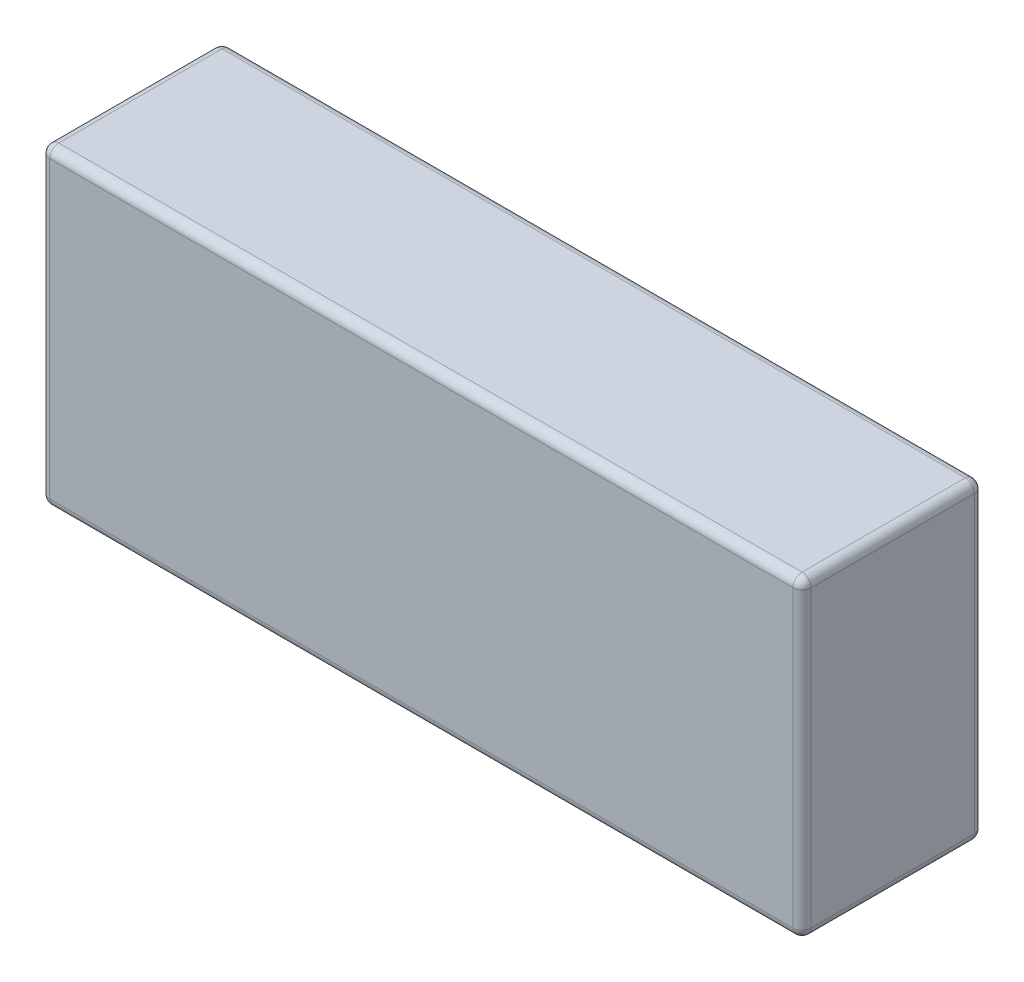
ISO-10303-21;
HEADER;
FILE_DESCRIPTION(('STEP AP214'),'2;1');
FILE_NAME('part.step','',(''),(''),'','','');
FILE_SCHEMA(('AUTOMOTIVE_DESIGN { 1 0 10303 214 1 1 1 1 }'));
ENDSEC;
DATA;
#1=APPLICATION_CONTEXT('core data for automotive mechanical design processes');
#2=APPLICATION_PROTOCOL_DEFINITION('international standard','automotive_design',2000,#1);
#3=PRODUCT_CONTEXT('',#1,'mechanical');
#4=PRODUCT('Part','Part','',(#3));
#5=PRODUCT_RELATED_PRODUCT_CATEGORY('part','',(#4));
#6=PRODUCT_DEFINITION_FORMATION('','',#4);
#7=PRODUCT_DEFINITION_CONTEXT('part definition',#1,'design');
#8=PRODUCT_DEFINITION('design','',#6,#7);
#9=PRODUCT_DEFINITION_SHAPE('','',#8);
#10=(LENGTH_UNIT() NAMED_UNIT(*) SI_UNIT(.MILLI.,.METRE.));
#11=(NAMED_UNIT(*) PLANE_ANGLE_UNIT() SI_UNIT($,.RADIAN.));
#12=(NAMED_UNIT(*) SI_UNIT($,.STERADIAN.) SOLID_ANGLE_UNIT());
#13=UNCERTAINTY_MEASURE_WITH_UNIT(LENGTH_MEASURE(1.E-05),#10,'distance_accuracy_value','');
#14=(GEOMETRIC_REPRESENTATION_CONTEXT(3) GLOBAL_UNCERTAINTY_ASSIGNED_CONTEXT((#13)) GLOBAL_UNIT_ASSIGNED_CONTEXT((#10,
#11,#12)) REPRESENTATION_CONTEXT('',''));
#15=CARTESIAN_POINT('',(0.,0.,0.));
#16=DIRECTION('',(0.,0.,1.));
#17=DIRECTION('',(1.,0.,0.));
#18=AXIS2_PLACEMENT_3D('',#15,#16,#17);
#19=CARTESIAN_POINT('',(168.,69.,0.));
#20=DIRECTION('',(0.,0.,1.));
#21=DIRECTION('',(1.,0.,0.));
#22=AXIS2_PLACEMENT_3D('',#19,#20,#21);
#23=PLANE('',#22);
#24=DIRECTION('',(0.,-1.,0.));
#25=VECTOR('',#24,1.);
#26=CARTESIAN_POINT('',(2.,69.,0.));
#27=LINE('',#26,#25);
#28=CARTESIAN_POINT('',(2.,2.,0.));
#29=VERTEX_POINT('',#28);
#30=CARTESIAN_POINT('',(2.,67.,0.));
#31=VERTEX_POINT('',#30);
#32=EDGE_CURVE('E132',#29,#31,#27,.F.);
#33=ORIENTED_EDGE('',*,*,#32,.T.);
#34=DIRECTION('',(-1.,0.,0.));
#35=VECTOR('',#34,1.);
#36=CARTESIAN_POINT('',(168.,67.,0.));
#37=LINE('',#36,#35);
#38=CARTESIAN_POINT('',(166.,67.,0.));
#39=VERTEX_POINT('',#38);
#40=EDGE_CURVE('E169',#31,#39,#37,.F.);
#41=ORIENTED_EDGE('',*,*,#40,.T.);
#42=DIRECTION('',(0.,-1.,0.));
#43=VECTOR('',#42,1.);
#44=CARTESIAN_POINT('',(166.,69.,0.));
#45=LINE('',#44,#43);
#46=CARTESIAN_POINT('',(166.,2.,0.));
#47=VERTEX_POINT('',#46);
#48=EDGE_CURVE('E166',#39,#47,#45,.T.);
#49=ORIENTED_EDGE('',*,*,#48,.T.);
#50=DIRECTION('',(-1.,0.,0.));
#51=VECTOR('',#50,1.);
#52=CARTESIAN_POINT('',(168.,2.,0.));
#53=LINE('',#52,#51);
#54=EDGE_CURVE('E161',#47,#29,#53,.T.);
#55=ORIENTED_EDGE('',*,*,#54,.T.);
#56=EDGE_LOOP('',(#33,#41,#49,#55));
#57=FACE_BOUND('',#56,.T.);
#58=ADVANCED_FACE('F37',(#57),#23,.F.);
#59=CARTESIAN_POINT('',(0.,69.,0.));
#60=DIRECTION('',(1.,0.,0.));
#61=DIRECTION('',(0.,0.,-1.));
#62=AXIS2_PLACEMENT_3D('',#59,#60,#61);
#63=PLANE('',#62);
#64=DIRECTION('',(0.,-1.,0.));
#65=VECTOR('',#64,1.);
#66=CARTESIAN_POINT('',(0.,69.,38.));
#67=LINE('',#66,#65);
#68=CARTESIAN_POINT('',(0.,2.,38.));
#69=VERTEX_POINT('',#68);
#70=CARTESIAN_POINT('',(0.,67.,38.));
#71=VERTEX_POINT('',#70);
#72=EDGE_CURVE('E154',#69,#71,#67,.F.);
#73=ORIENTED_EDGE('',*,*,#72,.T.);
#74=DIRECTION('',(0.,0.,1.));
#75=VECTOR('',#74,1.);
#76=CARTESIAN_POINT('',(0.,67.,0.));
#77=LINE('',#76,#75);
#78=CARTESIAN_POINT('',(0.,67.,2.));
#79=VERTEX_POINT('',#78);
#80=EDGE_CURVE('E158',#71,#79,#77,.F.);
#81=ORIENTED_EDGE('',*,*,#80,.T.);
#82=DIRECTION('',(0.,-1.,0.));
#83=VECTOR('',#82,1.);
#84=CARTESIAN_POINT('',(0.,69.,2.));
#85=LINE('',#84,#83);
#86=CARTESIAN_POINT('',(0.,2.,2.));
#87=VERTEX_POINT('',#86);
#88=EDGE_CURVE('E130',#79,#87,#85,.T.);
#89=ORIENTED_EDGE('',*,*,#88,.T.);
#90=DIRECTION('',(0.,0.,1.));
#91=VECTOR('',#90,1.);
#92=CARTESIAN_POINT('',(0.,2.,0.));
#93=LINE('',#92,#91);
#94=EDGE_CURVE('E148',#87,#69,#93,.T.);
#95=ORIENTED_EDGE('',*,*,#94,.T.);
#96=EDGE_LOOP('',(#73,#81,#89,#95));
#97=FACE_BOUND('',#96,.T.);
#98=ADVANCED_FACE('F156',(#97),#63,.F.);
#99=CARTESIAN_POINT('',(0.,69.,40.));
#100=DIRECTION('',(0.,0.,-1.));
#101=DIRECTION('',(-1.,0.,0.));
#102=AXIS2_PLACEMENT_3D('',#99,#100,#101);
#103=PLANE('',#102);
#104=DIRECTION('',(0.,-1.,0.));
#105=VECTOR('',#104,1.);
#106=CARTESIAN_POINT('',(166.,69.,40.));
#107=LINE('',#106,#105);
#108=CARTESIAN_POINT('',(166.,2.,40.));
#109=VERTEX_POINT('',#108);
#110=CARTESIAN_POINT('',(166.,67.,40.));
#111=VERTEX_POINT('',#110);
#112=EDGE_CURVE('E173',#109,#111,#107,.F.);
#113=ORIENTED_EDGE('',*,*,#112,.T.);
#114=DIRECTION('',(1.,0.,0.));
#115=VECTOR('',#114,1.);
#116=CARTESIAN_POINT('',(0.,67.,40.));
#117=LINE('',#116,#115);
#118=CARTESIAN_POINT('',(2.,67.,40.));
#119=VERTEX_POINT('',#118);
#120=EDGE_CURVE('E178',#111,#119,#117,.F.);
#121=ORIENTED_EDGE('',*,*,#120,.T.);
#122=DIRECTION('',(0.,-1.,0.));
#123=VECTOR('',#122,1.);
#124=CARTESIAN_POINT('',(2.,69.,40.));
#125=LINE('',#124,#123);
#126=CARTESIAN_POINT('',(2.,2.,40.));
#127=VERTEX_POINT('',#126);
#128=EDGE_CURVE('E175',#119,#127,#125,.T.);
#129=ORIENTED_EDGE('',*,*,#128,.T.);
#130=DIRECTION('',(1.,0.,0.));
#131=VECTOR('',#130,1.);
#132=CARTESIAN_POINT('',(0.,2.,40.));
#133=LINE('',#132,#131);
#134=EDGE_CURVE('E171',#127,#109,#133,.T.);
#135=ORIENTED_EDGE('',*,*,#134,.T.);
#136=EDGE_LOOP('',(#113,#121,#129,#135));
#137=FACE_BOUND('',#136,.T.);
#138=ADVANCED_FACE('F283',(#137),#103,.F.);
#139=CARTESIAN_POINT('',(168.,69.,40.));
#140=DIRECTION('',(-1.,0.,0.));
#141=DIRECTION('',(0.,0.,1.));
#142=AXIS2_PLACEMENT_3D('',#139,#140,#141);
#143=PLANE('',#142);
#144=DIRECTION('',(0.,-1.,0.));
#145=VECTOR('',#144,1.);
#146=CARTESIAN_POINT('',(168.,69.,2.));
#147=LINE('',#146,#145);
#148=CARTESIAN_POINT('',(168.,2.,2.));
#149=VERTEX_POINT('',#148);
#150=CARTESIAN_POINT('',(168.,67.,2.));
#151=VERTEX_POINT('',#150);
#152=EDGE_CURVE('E182',#149,#151,#147,.F.);
#153=ORIENTED_EDGE('',*,*,#152,.T.);
#154=DIRECTION('',(0.,0.,-1.));
#155=VECTOR('',#154,1.);
#156=CARTESIAN_POINT('',(168.,67.,40.));
#157=LINE('',#156,#155);
#158=CARTESIAN_POINT('',(168.,67.,38.));
#159=VERTEX_POINT('',#158);
#160=EDGE_CURVE('E187',#151,#159,#157,.F.);
#161=ORIENTED_EDGE('',*,*,#160,.T.);
#162=DIRECTION('',(0.,-1.,0.));
#163=VECTOR('',#162,1.);
#164=CARTESIAN_POINT('',(168.,69.,38.));
#165=LINE('',#164,#163);
#166=CARTESIAN_POINT('',(168.,2.,38.));
#167=VERTEX_POINT('',#166);
#168=EDGE_CURVE('E184',#159,#167,#165,.T.);
#169=ORIENTED_EDGE('',*,*,#168,.T.);
#170=DIRECTION('',(0.,0.,-1.));
#171=VECTOR('',#170,1.);
#172=CARTESIAN_POINT('',(168.,2.,40.));
#173=LINE('',#172,#171);
#174=EDGE_CURVE('E180',#167,#149,#173,.T.);
#175=ORIENTED_EDGE('',*,*,#174,.T.);
#176=EDGE_LOOP('',(#153,#161,#169,#175));
#177=FACE_BOUND('',#176,.T.);
#178=ADVANCED_FACE('F293',(#177),#143,.F.);
#179=CARTESIAN_POINT('',(0.,69.,0.));
#180=DIRECTION('',(0.,1.,0.));
#181=DIRECTION('',(0.,0.,1.));
#182=AXIS2_PLACEMENT_3D('',#179,#180,#181);
#183=PLANE('',#182);
#184=DIRECTION('',(1.,0.,0.));
#185=VECTOR('',#184,1.);
#186=CARTESIAN_POINT('',(168.,69.,38.));
#187=LINE('',#186,#185);
#188=CARTESIAN_POINT('',(2.,69.,38.));
#189=VERTEX_POINT('',#188);
#190=CARTESIAN_POINT('',(166.,69.,38.));
#191=VERTEX_POINT('',#190);
#192=EDGE_CURVE('E193',#189,#191,#187,.T.);
#193=ORIENTED_EDGE('',*,*,#192,.T.);
#194=DIRECTION('',(0.,0.,-1.));
#195=VECTOR('',#194,1.);
#196=CARTESIAN_POINT('',(166.,69.,0.));
#197=LINE('',#196,#195);
#198=CARTESIAN_POINT('',(166.,69.,2.));
#199=VERTEX_POINT('',#198);
#200=EDGE_CURVE('E195',#191,#199,#197,.T.);
#201=ORIENTED_EDGE('',*,*,#200,.T.);
#202=DIRECTION('',(-1.,0.,0.));
#203=VECTOR('',#202,1.);
#204=CARTESIAN_POINT('',(0.,69.,2.));
#205=LINE('',#204,#203);
#206=CARTESIAN_POINT('',(2.,69.,2.));
#207=VERTEX_POINT('',#206);
#208=EDGE_CURVE('E189',#199,#207,#205,.T.);
#209=ORIENTED_EDGE('',*,*,#208,.T.);
#210=DIRECTION('',(0.,0.,1.));
#211=VECTOR('',#210,1.);
#212=CARTESIAN_POINT('',(2.,69.,40.));
#213=LINE('',#212,#211);
#214=EDGE_CURVE('E191',#207,#189,#213,.T.);
#215=ORIENTED_EDGE('',*,*,#214,.T.);
#216=EDGE_LOOP('',(#193,#201,#209,#215));
#217=FACE_BOUND('',#216,.T.);
#218=ADVANCED_FACE('F275',(#217),#183,.T.);
#219=CARTESIAN_POINT('',(0.,0.,0.));
#220=DIRECTION('',(0.,1.,0.));
#221=DIRECTION('',(0.,0.,1.));
#222=AXIS2_PLACEMENT_3D('',#219,#220,#221);
#223=PLANE('',#222);
#224=DIRECTION('',(-1.,0.,0.));
#225=VECTOR('',#224,1.);
#226=CARTESIAN_POINT('',(0.,0.,2.));
#227=LINE('',#226,#225);
#228=CARTESIAN_POINT('',(2.,0.,2.));
#229=VERTEX_POINT('',#228);
#230=CARTESIAN_POINT('',(166.,0.,2.));
#231=VERTEX_POINT('',#230);
#232=EDGE_CURVE('E198',#229,#231,#227,.F.);
#233=ORIENTED_EDGE('',*,*,#232,.T.);
#234=DIRECTION('',(0.,0.,-1.));
#235=VECTOR('',#234,1.);
#236=CARTESIAN_POINT('',(166.,0.,0.));
#237=LINE('',#236,#235);
#238=CARTESIAN_POINT('',(166.,0.,38.));
#239=VERTEX_POINT('',#238);
#240=EDGE_CURVE('E11',#231,#239,#237,.F.);
#241=ORIENTED_EDGE('',*,*,#240,.T.);
#242=DIRECTION('',(1.,0.,0.));
#243=VECTOR('',#242,1.);
#244=CARTESIAN_POINT('',(0.,0.,38.));
#245=LINE('',#244,#243);
#246=CARTESIAN_POINT('',(2.,0.,38.));
#247=VERTEX_POINT('',#246);
#248=EDGE_CURVE('E46',#239,#247,#245,.F.);
#249=ORIENTED_EDGE('',*,*,#248,.T.);
#250=DIRECTION('',(0.,0.,1.));
#251=VECTOR('',#250,1.);
#252=CARTESIAN_POINT('',(2.,0.,0.));
#253=LINE('',#252,#251);
#254=EDGE_CURVE('E200',#247,#229,#253,.F.);
#255=ORIENTED_EDGE('',*,*,#254,.T.);
#256=EDGE_LOOP('',(#233,#241,#249,#255));
#257=FACE_BOUND('',#256,.T.);
#258=ADVANCED_FACE('F521',(#257),#223,.F.);
#259=CARTESIAN_POINT('',(166.,69.,38.));
#260=DIRECTION('',(0.,-1.,0.));
#261=DIRECTION('',(0.,0.,-1.));
#262=AXIS2_PLACEMENT_3D('',#259,#260,#261);
#263=CYLINDRICAL_SURFACE('',#262,2.);
#264=CARTESIAN_POINT('',(166.,67.,38.));
#265=DIRECTION('',(0.,1.,0.));
#266=DIRECTION('',(0.,0.,1.));
#267=AXIS2_PLACEMENT_3D('',#264,#265,#266);
#268=CIRCLE('',#267,2.);
#269=EDGE_CURVE('E41',#111,#159,#268,.T.);
#270=ORIENTED_EDGE('',*,*,#269,.F.);
#271=ORIENTED_EDGE('',*,*,#112,.F.);
#272=CARTESIAN_POINT('',(166.,2.,38.));
#273=DIRECTION('',(0.,-1.,0.));
#274=DIRECTION('',(0.,0.,-1.));
#275=AXIS2_PLACEMENT_3D('',#272,#273,#274);
#276=CIRCLE('',#275,2.);
#277=EDGE_CURVE('E253',#167,#109,#276,.T.);
#278=ORIENTED_EDGE('',*,*,#277,.F.);
#279=ORIENTED_EDGE('',*,*,#168,.F.);
#280=EDGE_LOOP('',(#270,#271,#278,#279));
#281=FACE_BOUND('',#280,.T.);
#282=ADVANCED_FACE('F39',(#281),#263,.T.);
#283=CARTESIAN_POINT('',(166.,67.,38.));
#284=DIRECTION('',(1.,0.,0.));
#285=DIRECTION('',(0.,0.,-1.));
#286=AXIS2_PLACEMENT_3D('',#283,#284,#285);
#287=SPHERICAL_SURFACE('',#286,2.);
#288=CARTESIAN_POINT('',(166.,67.,38.));
#289=DIRECTION('',(1.,0.,0.));
#290=DIRECTION('',(0.,0.,-1.));
#291=AXIS2_PLACEMENT_3D('',#288,#289,#290);
#292=CIRCLE('',#291,2.);
#293=EDGE_CURVE('E248',#111,#191,#292,.F.);
#294=ORIENTED_EDGE('',*,*,#293,.F.);
#295=ORIENTED_EDGE('',*,*,#269,.T.);
#296=CARTESIAN_POINT('',(166.,67.,38.));
#297=DIRECTION('',(0.,0.,1.));
#298=DIRECTION('',(1.,0.,0.));
#299=AXIS2_PLACEMENT_3D('',#296,#297,#298);
#300=CIRCLE('',#299,2.);
#301=EDGE_CURVE('E251',#191,#159,#300,.F.);
#302=ORIENTED_EDGE('',*,*,#301,.F.);
#303=EDGE_LOOP('',(#294,#295,#302));
#304=FACE_BOUND('',#303,.T.);
#305=ADVANCED_FACE('F263',(#304),#287,.T.);
#306=CARTESIAN_POINT('',(166.,2.,38.));
#307=DIRECTION('',(0.,0.,1.));
#308=DIRECTION('',(0.,-1.,0.));
#309=AXIS2_PLACEMENT_3D('',#306,#307,#308);
#310=SPHERICAL_SURFACE('',#309,2.);
#311=CARTESIAN_POINT('',(166.,2.,38.));
#312=DIRECTION('',(0.,0.,1.));
#313=DIRECTION('',(1.,0.,0.));
#314=AXIS2_PLACEMENT_3D('',#311,#312,#313);
#315=CIRCLE('',#314,2.);
#316=EDGE_CURVE('E243',#167,#239,#315,.F.);
#317=ORIENTED_EDGE('',*,*,#316,.F.);
#318=ORIENTED_EDGE('',*,*,#277,.T.);
#319=CARTESIAN_POINT('',(166.,2.,38.));
#320=DIRECTION('',(1.,0.,0.));
#321=DIRECTION('',(0.,0.,-1.));
#322=AXIS2_PLACEMENT_3D('',#319,#320,#321);
#323=CIRCLE('',#322,2.);
#324=EDGE_CURVE('E246',#239,#109,#323,.F.);
#325=ORIENTED_EDGE('',*,*,#324,.F.);
#326=EDGE_LOOP('',(#317,#318,#325));
#327=FACE_BOUND('',#326,.T.);
#328=ADVANCED_FACE('F494',(#327),#310,.T.);
#329=CARTESIAN_POINT('',(166.,67.,0.));
#330=DIRECTION('',(0.,0.,1.));
#331=DIRECTION('',(1.,0.,0.));
#332=AXIS2_PLACEMENT_3D('',#329,#330,#331);
#333=CYLINDRICAL_SURFACE('',#332,2.);
#334=ORIENTED_EDGE('',*,*,#301,.T.);
#335=ORIENTED_EDGE('',*,*,#160,.F.);
#336=CARTESIAN_POINT('',(166.,67.,2.));
#337=DIRECTION('',(0.,0.,-1.));
#338=DIRECTION('',(-1.,0.,0.));
#339=AXIS2_PLACEMENT_3D('',#336,#337,#338);
#340=CIRCLE('',#339,2.);
#341=EDGE_CURVE('E237',#199,#151,#340,.T.);
#342=ORIENTED_EDGE('',*,*,#341,.F.);
#343=ORIENTED_EDGE('',*,*,#200,.F.);
#344=EDGE_LOOP('',(#334,#335,#342,#343));
#345=FACE_BOUND('',#344,.T.);
#346=ADVANCED_FACE('F271',(#345),#333,.T.);
#347=CARTESIAN_POINT('',(0.,67.,38.));
#348=DIRECTION('',(-1.,0.,0.));
#349=DIRECTION('',(0.,0.,1.));
#350=AXIS2_PLACEMENT_3D('',#347,#348,#349);
#351=CYLINDRICAL_SURFACE('',#350,2.);
#352=ORIENTED_EDGE('',*,*,#293,.T.);
#353=ORIENTED_EDGE('',*,*,#192,.F.);
#354=CARTESIAN_POINT('',(2.,67.,38.));
#355=DIRECTION('',(-1.,0.,0.));
#356=DIRECTION('',(0.,-1.,0.));
#357=AXIS2_PLACEMENT_3D('',#354,#355,#356);
#358=CIRCLE('',#357,2.);
#359=EDGE_CURVE('E234',#119,#189,#358,.T.);
#360=ORIENTED_EDGE('',*,*,#359,.F.);
#361=ORIENTED_EDGE('',*,*,#120,.F.);
#362=EDGE_LOOP('',(#352,#353,#360,#361));
#363=FACE_BOUND('',#362,.T.);
#364=ADVANCED_FACE('F280',(#363),#351,.T.);
#365=CARTESIAN_POINT('',(2.,69.,38.));
#366=DIRECTION('',(0.,-1.,0.));
#367=DIRECTION('',(0.,0.,-1.));
#368=AXIS2_PLACEMENT_3D('',#365,#366,#367);
#369=CYLINDRICAL_SURFACE('',#368,2.);
#370=CARTESIAN_POINT('',(2.,2.,38.));
#371=DIRECTION('',(0.,-1.,0.));
#372=DIRECTION('',(0.,0.,-1.));
#373=AXIS2_PLACEMENT_3D('',#370,#371,#372);
#374=CIRCLE('',#373,2.);
#375=EDGE_CURVE('E228',#127,#69,#374,.T.);
#376=ORIENTED_EDGE('',*,*,#375,.F.);
#377=ORIENTED_EDGE('',*,*,#128,.F.);
#378=CARTESIAN_POINT('',(2.,67.,38.));
#379=DIRECTION('',(0.,1.,0.));
#380=DIRECTION('',(0.,0.,1.));
#381=AXIS2_PLACEMENT_3D('',#378,#379,#380);
#382=CIRCLE('',#381,2.);
#383=EDGE_CURVE('E231',#71,#119,#382,.T.);
#384=ORIENTED_EDGE('',*,*,#383,.F.);
#385=ORIENTED_EDGE('',*,*,#72,.F.);
#386=EDGE_LOOP('',(#376,#377,#384,#385));
#387=FACE_BOUND('',#386,.T.);
#388=ADVANCED_FACE('F287',(#387),#369,.T.);
#389=CARTESIAN_POINT('',(0.,2.,38.));
#390=DIRECTION('',(1.,0.,0.));
#391=DIRECTION('',(0.,0.,-1.));
#392=AXIS2_PLACEMENT_3D('',#389,#390,#391);
#393=CYLINDRICAL_SURFACE('',#392,2.);
#394=ORIENTED_EDGE('',*,*,#324,.T.);
#395=ORIENTED_EDGE('',*,*,#134,.F.);
#396=CARTESIAN_POINT('',(2.,2.,38.));
#397=DIRECTION('',(-1.,0.,0.));
#398=DIRECTION('',(0.,0.,1.));
#399=AXIS2_PLACEMENT_3D('',#396,#397,#398);
#400=CIRCLE('',#399,2.);
#401=EDGE_CURVE('E226',#247,#127,#400,.T.);
#402=ORIENTED_EDGE('',*,*,#401,.F.);
#403=ORIENTED_EDGE('',*,*,#248,.F.);
#404=EDGE_LOOP('',(#394,#395,#402,#403));
#405=FACE_BOUND('',#404,.T.);
#406=ADVANCED_FACE('F291',(#405),#393,.T.);
#407=CARTESIAN_POINT('',(166.,2.,40.));
#408=DIRECTION('',(0.,0.,-1.));
#409=DIRECTION('',(-1.,0.,0.));
#410=AXIS2_PLACEMENT_3D('',#407,#408,#409);
#411=CYLINDRICAL_SURFACE('',#410,2.);
#412=ORIENTED_EDGE('',*,*,#316,.T.);
#413=ORIENTED_EDGE('',*,*,#240,.F.);
#414=CARTESIAN_POINT('',(166.,2.,2.));
#415=DIRECTION('',(0.,0.,-1.));
#416=DIRECTION('',(-1.,0.,0.));
#417=AXIS2_PLACEMENT_3D('',#414,#415,#416);
#418=CIRCLE('',#417,2.);
#419=EDGE_CURVE('E223',#149,#231,#418,.T.);
#420=ORIENTED_EDGE('',*,*,#419,.F.);
#421=ORIENTED_EDGE('',*,*,#174,.F.);
#422=EDGE_LOOP('',(#412,#413,#420,#421));
#423=FACE_BOUND('',#422,.T.);
#424=ADVANCED_FACE('F303',(#423),#411,.T.);
#425=CARTESIAN_POINT('',(166.,69.,2.));
#426=DIRECTION('',(0.,-1.,0.));
#427=DIRECTION('',(0.,0.,-1.));
#428=AXIS2_PLACEMENT_3D('',#425,#426,#427);
#429=CYLINDRICAL_SURFACE('',#428,2.);
#430=CARTESIAN_POINT('',(166.,67.,2.));
#431=DIRECTION('',(0.,1.,0.));
#432=DIRECTION('',(0.,0.,1.));
#433=AXIS2_PLACEMENT_3D('',#430,#431,#432);
#434=CIRCLE('',#433,2.);
#435=EDGE_CURVE('E240',#151,#39,#434,.T.);
#436=ORIENTED_EDGE('',*,*,#435,.F.);
#437=ORIENTED_EDGE('',*,*,#152,.F.);
#438=CARTESIAN_POINT('',(166.,2.,2.));
#439=DIRECTION('',(0.,-1.,0.));
#440=DIRECTION('',(0.,0.,-1.));
#441=AXIS2_PLACEMENT_3D('',#438,#439,#440);
#442=CIRCLE('',#441,2.);
#443=EDGE_CURVE('E220',#47,#149,#442,.T.);
#444=ORIENTED_EDGE('',*,*,#443,.F.);
#445=ORIENTED_EDGE('',*,*,#48,.F.);
#446=EDGE_LOOP('',(#436,#437,#444,#445));
#447=FACE_BOUND('',#446,.T.);
#448=ADVANCED_FACE('F298',(#447),#429,.T.);
#449=CARTESIAN_POINT('',(166.,67.,2.));
#450=DIRECTION('',(1.,0.,0.));
#451=DIRECTION('',(0.,0.,-1.));
#452=AXIS2_PLACEMENT_3D('',#449,#450,#451);
#453=SPHERICAL_SURFACE('',#452,2.);
#454=ORIENTED_EDGE('',*,*,#341,.T.);
#455=ORIENTED_EDGE('',*,*,#435,.T.);
#456=CARTESIAN_POINT('',(166.,67.,2.));
#457=DIRECTION('',(1.,0.,0.));
#458=DIRECTION('',(0.,0.,-1.));
#459=AXIS2_PLACEMENT_3D('',#456,#457,#458);
#460=CIRCLE('',#459,2.);
#461=EDGE_CURVE('E217',#199,#39,#460,.F.);
#462=ORIENTED_EDGE('',*,*,#461,.F.);
#463=EDGE_LOOP('',(#454,#455,#462));
#464=FACE_BOUND('',#463,.T.);
#465=ADVANCED_FACE('F314',(#464),#453,.T.);
#466=CARTESIAN_POINT('',(2.,67.,38.));
#467=DIRECTION('',(0.,0.,1.));
#468=DIRECTION('',(1.,0.,0.));
#469=AXIS2_PLACEMENT_3D('',#466,#467,#468);
#470=SPHERICAL_SURFACE('',#469,2.);
#471=ORIENTED_EDGE('',*,*,#383,.T.);
#472=ORIENTED_EDGE('',*,*,#359,.T.);
#473=CARTESIAN_POINT('',(2.,67.,38.));
#474=DIRECTION('',(0.,0.,1.));
#475=DIRECTION('',(1.,0.,0.));
#476=AXIS2_PLACEMENT_3D('',#473,#474,#475);
#477=CIRCLE('',#476,2.);
#478=EDGE_CURVE('E214',#71,#189,#477,.F.);
#479=ORIENTED_EDGE('',*,*,#478,.F.);
#480=EDGE_LOOP('',(#471,#472,#479));
#481=FACE_BOUND('',#480,.T.);
#482=ADVANCED_FACE('F324',(#481),#470,.T.);
#483=CARTESIAN_POINT('',(2.,2.,38.));
#484=DIRECTION('',(0.,0.,1.));
#485=DIRECTION('',(0.,-1.,0.));
#486=AXIS2_PLACEMENT_3D('',#483,#484,#485);
#487=SPHERICAL_SURFACE('',#486,2.);
#488=ORIENTED_EDGE('',*,*,#401,.T.);
#489=ORIENTED_EDGE('',*,*,#375,.T.);
#490=CARTESIAN_POINT('',(2.,2.,38.));
#491=DIRECTION('',(0.,0.,1.));
#492=DIRECTION('',(1.,0.,0.));
#493=AXIS2_PLACEMENT_3D('',#490,#491,#492);
#494=CIRCLE('',#493,2.);
#495=EDGE_CURVE('E151',#247,#69,#494,.F.);
#496=ORIENTED_EDGE('',*,*,#495,.F.);
#497=EDGE_LOOP('',(#488,#489,#496));
#498=FACE_BOUND('',#497,.T.);
#499=ADVANCED_FACE('F326',(#498),#487,.T.);
#500=CARTESIAN_POINT('',(166.,2.,2.));
#501=DIRECTION('',(1.,0.,0.));
#502=DIRECTION('',(0.,1.,0.));
#503=AXIS2_PLACEMENT_3D('',#500,#501,#502);
#504=SPHERICAL_SURFACE('',#503,2.);
#505=ORIENTED_EDGE('',*,*,#443,.T.);
#506=ORIENTED_EDGE('',*,*,#419,.T.);
#507=CARTESIAN_POINT('',(166.,2.,2.));
#508=DIRECTION('',(1.,0.,0.));
#509=DIRECTION('',(0.,0.,-1.));
#510=AXIS2_PLACEMENT_3D('',#507,#508,#509);
#511=CIRCLE('',#510,2.);
#512=EDGE_CURVE('E210',#47,#231,#511,.F.);
#513=ORIENTED_EDGE('',*,*,#512,.F.);
#514=EDGE_LOOP('',(#505,#506,#513));
#515=FACE_BOUND('',#514,.T.);
#516=ADVANCED_FACE('F305',(#515),#504,.T.);
#517=CARTESIAN_POINT('',(0.,67.,2.));
#518=DIRECTION('',(1.,0.,0.));
#519=DIRECTION('',(0.,0.,-1.));
#520=AXIS2_PLACEMENT_3D('',#517,#518,#519);
#521=CYLINDRICAL_SURFACE('',#520,2.);
#522=ORIENTED_EDGE('',*,*,#461,.T.);
#523=ORIENTED_EDGE('',*,*,#40,.F.);
#524=CARTESIAN_POINT('',(2.,67.,2.));
#525=DIRECTION('',(-1.,0.,0.));
#526=DIRECTION('',(0.,0.,1.));
#527=AXIS2_PLACEMENT_3D('',#524,#525,#526);
#528=CIRCLE('',#527,2.);
#529=EDGE_CURVE('E207',#207,#31,#528,.T.);
#530=ORIENTED_EDGE('',*,*,#529,.F.);
#531=ORIENTED_EDGE('',*,*,#208,.F.);
#532=EDGE_LOOP('',(#522,#523,#530,#531));
#533=FACE_BOUND('',#532,.T.);
#534=ADVANCED_FACE('F316',(#533),#521,.T.);
#535=CARTESIAN_POINT('',(2.,67.,0.));
#536=DIRECTION('',(0.,0.,-1.));
#537=DIRECTION('',(-1.,0.,0.));
#538=AXIS2_PLACEMENT_3D('',#535,#536,#537);
#539=CYLINDRICAL_SURFACE('',#538,2.);
#540=ORIENTED_EDGE('',*,*,#478,.T.);
#541=ORIENTED_EDGE('',*,*,#214,.F.);
#542=CARTESIAN_POINT('',(2.,67.,2.));
#543=DIRECTION('',(0.,0.,-1.));
#544=DIRECTION('',(-1.,0.,0.));
#545=AXIS2_PLACEMENT_3D('',#542,#543,#544);
#546=CIRCLE('',#545,2.);
#547=EDGE_CURVE('E145',#79,#207,#546,.T.);
#548=ORIENTED_EDGE('',*,*,#547,.F.);
#549=ORIENTED_EDGE('',*,*,#80,.F.);
#550=EDGE_LOOP('',(#540,#541,#548,#549));
#551=FACE_BOUND('',#550,.T.);
#552=ADVANCED_FACE('F322',(#551),#539,.T.);
#553=CARTESIAN_POINT('',(2.,2.,0.));
#554=DIRECTION('',(0.,0.,1.));
#555=DIRECTION('',(1.,0.,0.));
#556=AXIS2_PLACEMENT_3D('',#553,#554,#555);
#557=CYLINDRICAL_SURFACE('',#556,2.);
#558=ORIENTED_EDGE('',*,*,#495,.T.);
#559=ORIENTED_EDGE('',*,*,#94,.F.);
#560=CARTESIAN_POINT('',(2.,2.,2.));
#561=DIRECTION('',(0.,0.,-1.));
#562=DIRECTION('',(-1.,0.,0.));
#563=AXIS2_PLACEMENT_3D('',#560,#561,#562);
#564=CIRCLE('',#563,2.);
#565=EDGE_CURVE('E138',#229,#87,#564,.T.);
#566=ORIENTED_EDGE('',*,*,#565,.F.);
#567=ORIENTED_EDGE('',*,*,#254,.F.);
#568=EDGE_LOOP('',(#558,#559,#566,#567));
#569=FACE_BOUND('',#568,.T.);
#570=ADVANCED_FACE('F149',(#569),#557,.T.);
#571=CARTESIAN_POINT('',(168.,2.,2.));
#572=DIRECTION('',(-1.,0.,0.));
#573=DIRECTION('',(0.,0.,1.));
#574=AXIS2_PLACEMENT_3D('',#571,#572,#573);
#575=CYLINDRICAL_SURFACE('',#574,2.);
#576=ORIENTED_EDGE('',*,*,#512,.T.);
#577=ORIENTED_EDGE('',*,*,#232,.F.);
#578=CARTESIAN_POINT('',(2.,2.,2.));
#579=DIRECTION('',(-1.,0.,0.));
#580=DIRECTION('',(0.,0.,1.));
#581=AXIS2_PLACEMENT_3D('',#578,#579,#580);
#582=CIRCLE('',#581,2.);
#583=EDGE_CURVE('E142',#29,#229,#582,.T.);
#584=ORIENTED_EDGE('',*,*,#583,.F.);
#585=ORIENTED_EDGE('',*,*,#54,.F.);
#586=EDGE_LOOP('',(#576,#577,#584,#585));
#587=FACE_BOUND('',#586,.T.);
#588=ADVANCED_FACE('F309',(#587),#575,.T.);
#589=CARTESIAN_POINT('',(2.,67.,2.));
#590=DIRECTION('',(0.,1.,0.));
#591=DIRECTION('',(-1.,0.,0.));
#592=AXIS2_PLACEMENT_3D('',#589,#590,#591);
#593=SPHERICAL_SURFACE('',#592,2.);
#594=ORIENTED_EDGE('',*,*,#547,.T.);
#595=ORIENTED_EDGE('',*,*,#529,.T.);
#596=CARTESIAN_POINT('',(2.,67.,2.));
#597=DIRECTION('',(0.,1.,0.));
#598=DIRECTION('',(0.,0.,1.));
#599=AXIS2_PLACEMENT_3D('',#596,#597,#598);
#600=CIRCLE('',#599,2.);
#601=EDGE_CURVE('E135',#79,#31,#600,.F.);
#602=ORIENTED_EDGE('',*,*,#601,.F.);
#603=EDGE_LOOP('',(#594,#595,#602));
#604=FACE_BOUND('',#603,.T.);
#605=ADVANCED_FACE('F320',(#604),#593,.T.);
#606=CARTESIAN_POINT('',(2.,2.,2.));
#607=DIRECTION('',(0.,-1.,0.));
#608=DIRECTION('',(0.,0.,-1.));
#609=AXIS2_PLACEMENT_3D('',#606,#607,#608);
#610=SPHERICAL_SURFACE('',#609,2.);
#611=ORIENTED_EDGE('',*,*,#583,.T.);
#612=ORIENTED_EDGE('',*,*,#565,.T.);
#613=CARTESIAN_POINT('',(2.,2.,2.));
#614=DIRECTION('',(0.,-1.,0.));
#615=DIRECTION('',(0.,0.,-1.));
#616=AXIS2_PLACEMENT_3D('',#613,#614,#615);
#617=CIRCLE('',#616,2.);
#618=EDGE_CURVE('E126',#29,#87,#617,.F.);
#619=ORIENTED_EDGE('',*,*,#618,.F.);
#620=EDGE_LOOP('',(#611,#612,#619));
#621=FACE_BOUND('',#620,.T.);
#622=ADVANCED_FACE('F140',(#621),#610,.T.);
#623=CARTESIAN_POINT('',(2.,69.,2.));
#624=DIRECTION('',(0.,-1.,0.));
#625=DIRECTION('',(0.,0.,-1.));
#626=AXIS2_PLACEMENT_3D('',#623,#624,#625);
#627=CYLINDRICAL_SURFACE('',#626,2.);
#628=ORIENTED_EDGE('',*,*,#601,.T.);
#629=ORIENTED_EDGE('',*,*,#32,.F.);
#630=ORIENTED_EDGE('',*,*,#618,.T.);
#631=ORIENTED_EDGE('',*,*,#88,.F.);
#632=EDGE_LOOP('',(#628,#629,#630,#631));
#633=FACE_BOUND('',#632,.T.);
#634=ADVANCED_FACE('F128',(#633),#627,.T.);
#635=CLOSED_SHELL('',(#58,#98,#138,#178,#218,#258,#282,#305,#328,#346,#364,#388,#406,#424,#448,
#465,#482,#499,#516,#534,#552,#570,#588,#605,#622,#634));
#636=MANIFOLD_SOLID_BREP('B2',#635);
#637=ADVANCED_BREP_SHAPE_REPRESENTATION('',(#18,#636),#14);
#638=SHAPE_DEFINITION_REPRESENTATION(#9,#637);
ENDSEC;
END-ISO-10303-21;
